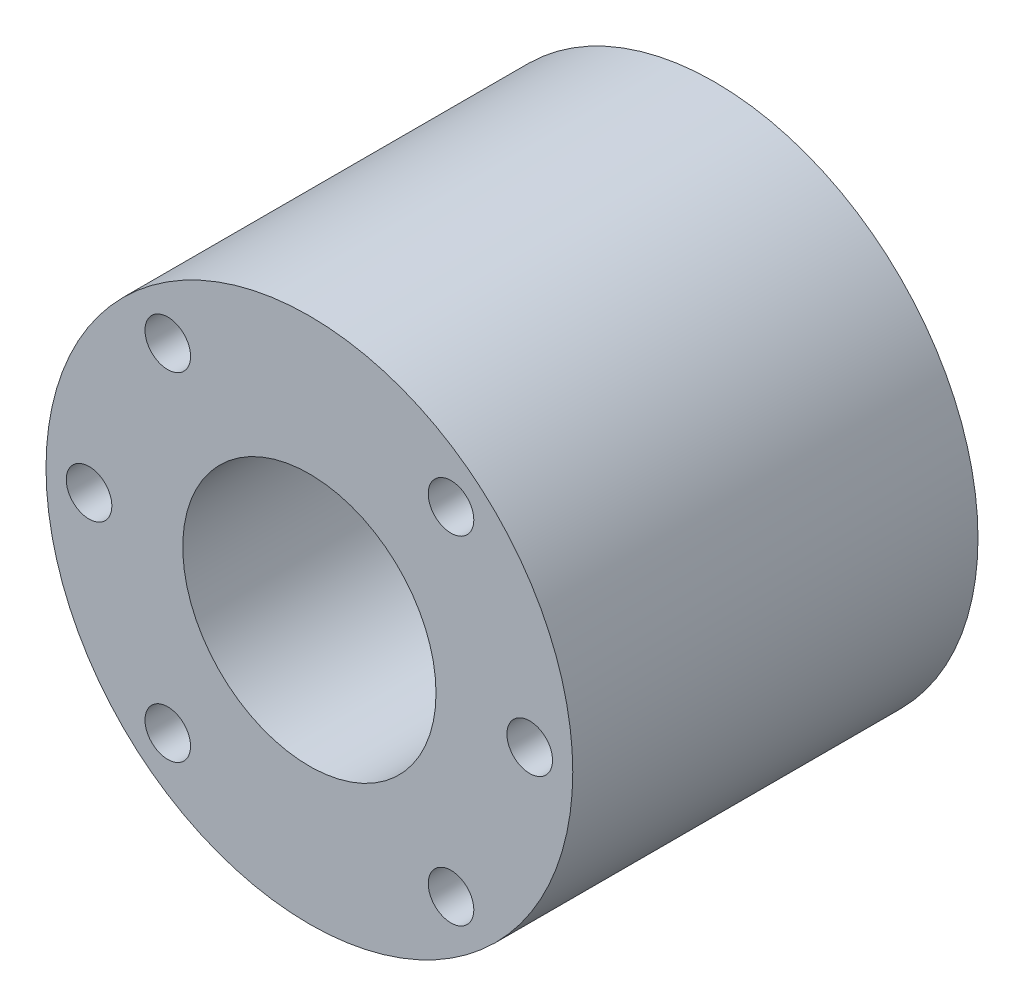
ISO-10303-21;
HEADER;
FILE_DESCRIPTION(('STEP AP214'),'2;1');
FILE_NAME('part.step','',(''),(''),'','','');
FILE_SCHEMA(('AUTOMOTIVE_DESIGN { 1 0 10303 214 1 1 1 1 }'));
ENDSEC;
DATA;
#1=APPLICATION_CONTEXT('core data for automotive mechanical design processes');
#2=APPLICATION_PROTOCOL_DEFINITION('international standard','automotive_design',2000,#1);
#3=PRODUCT_CONTEXT('',#1,'mechanical');
#4=PRODUCT('Part','Part','',(#3));
#5=PRODUCT_RELATED_PRODUCT_CATEGORY('part','',(#4));
#6=PRODUCT_DEFINITION_FORMATION('','',#4);
#7=PRODUCT_DEFINITION_CONTEXT('part definition',#1,'design');
#8=PRODUCT_DEFINITION('design','',#6,#7);
#9=PRODUCT_DEFINITION_SHAPE('','',#8);
#10=(LENGTH_UNIT() NAMED_UNIT(*) SI_UNIT(.MILLI.,.METRE.));
#11=(NAMED_UNIT(*) PLANE_ANGLE_UNIT() SI_UNIT($,.RADIAN.));
#12=(NAMED_UNIT(*) SI_UNIT($,.STERADIAN.) SOLID_ANGLE_UNIT());
#13=UNCERTAINTY_MEASURE_WITH_UNIT(LENGTH_MEASURE(1.E-05),#10,'distance_accuracy_value','');
#14=(GEOMETRIC_REPRESENTATION_CONTEXT(3) GLOBAL_UNCERTAINTY_ASSIGNED_CONTEXT((#13)) GLOBAL_UNIT_ASSIGNED_CONTEXT((#10,
#11,#12)) REPRESENTATION_CONTEXT('',''));
#15=CARTESIAN_POINT('',(0.,0.,0.));
#16=DIRECTION('',(0.,0.,1.));
#17=DIRECTION('',(1.,0.,0.));
#18=AXIS2_PLACEMENT_3D('',#15,#16,#17);
#19=CARTESIAN_POINT('',(0.,0.,40.));
#20=DIRECTION('',(0.,0.,1.));
#21=DIRECTION('',(1.,0.,0.));
#22=AXIS2_PLACEMENT_3D('',#19,#20,#21);
#23=PLANE('',#22);
#24=CARTESIAN_POINT('',(0.,0.,40.));
#25=DIRECTION('',(0.,0.,1.));
#26=DIRECTION('',(1.,0.,0.));
#27=AXIS2_PLACEMENT_3D('',#24,#25,#26);
#28=CIRCLE('',#27,12.5);
#29=CARTESIAN_POINT('',(12.5,0.,40.));
#30=VERTEX_POINT('',#29);
#31=EDGE_CURVE('E105',#30,#30,#28,.T.);
#32=ORIENTED_EDGE('',*,*,#31,.F.);
#33=EDGE_LOOP('',(#32));
#34=FACE_BOUND('',#33,.T.);
#35=CARTESIAN_POINT('',(21.75,0.,40.));
#36=DIRECTION('',(0.,0.,1.));
#37=DIRECTION('',(1.,0.,0.));
#38=AXIS2_PLACEMENT_3D('',#35,#36,#37);
#39=CIRCLE('',#38,2.25);
#40=CARTESIAN_POINT('',(24.,0.,40.));
#41=VERTEX_POINT('',#40);
#42=EDGE_CURVE('E85',#41,#41,#39,.T.);
#43=ORIENTED_EDGE('',*,*,#42,.F.);
#44=EDGE_LOOP('',(#43));
#45=FACE_BOUND('',#44,.T.);
#46=CARTESIAN_POINT('',(-13.9806305106822,-16.6614666378378,40.));
#47=DIRECTION('',(0.,0.,1.));
#48=DIRECTION('',(1.,0.,0.));
#49=AXIS2_PLACEMENT_3D('',#46,#47,#48);
#50=CIRCLE('',#49,2.25);
#51=CARTESIAN_POINT('',(-11.7306305106822,-16.6614666378378,40.));
#52=VERTEX_POINT('',#51);
#53=EDGE_CURVE('E69',#52,#52,#50,.T.);
#54=ORIENTED_EDGE('',*,*,#53,.F.);
#55=EDGE_LOOP('',(#54));
#56=FACE_BOUND('',#55,.T.);
#57=CARTESIAN_POINT('',(-21.75,0.,40.));
#58=DIRECTION('',(0.,0.,1.));
#59=DIRECTION('',(1.,0.,0.));
#60=AXIS2_PLACEMENT_3D('',#57,#58,#59);
#61=CIRCLE('',#60,2.25);
#62=CARTESIAN_POINT('',(-19.5,0.,40.));
#63=VERTEX_POINT('',#62);
#64=EDGE_CURVE('E55',#63,#63,#61,.T.);
#65=ORIENTED_EDGE('',*,*,#64,.F.);
#66=EDGE_LOOP('',(#65));
#67=FACE_BOUND('',#66,.T.);
#68=CARTESIAN_POINT('',(0.,0.,40.));
#69=DIRECTION('',(0.,0.,1.));
#70=DIRECTION('',(1.,0.,0.));
#71=AXIS2_PLACEMENT_3D('',#68,#69,#70);
#72=CIRCLE('',#71,26.);
#73=CARTESIAN_POINT('',(26.,0.,40.));
#74=VERTEX_POINT('',#73);
#75=EDGE_CURVE('E10',#74,#74,#72,.T.);
#76=ORIENTED_EDGE('',*,*,#75,.T.);
#77=EDGE_LOOP('',(#76));
#78=FACE_BOUND('',#77,.T.);
#79=CARTESIAN_POINT('',(-13.9806305106822,16.6614666378378,40.));
#80=DIRECTION('',(0.,0.,1.));
#81=DIRECTION('',(1.,0.,0.));
#82=AXIS2_PLACEMENT_3D('',#79,#80,#81);
#83=CIRCLE('',#82,2.25);
#84=CARTESIAN_POINT('',(-11.7306305106822,16.6614666378378,40.));
#85=VERTEX_POINT('',#84);
#86=EDGE_CURVE('E61',#85,#85,#83,.T.);
#87=ORIENTED_EDGE('',*,*,#86,.F.);
#88=EDGE_LOOP('',(#87));
#89=FACE_BOUND('',#88,.T.);
#90=CARTESIAN_POINT('',(13.9806305106822,-16.6614666378378,40.));
#91=DIRECTION('',(0.,0.,1.));
#92=DIRECTION('',(1.,0.,0.));
#93=AXIS2_PLACEMENT_3D('',#90,#91,#92);
#94=CIRCLE('',#93,2.25);
#95=CARTESIAN_POINT('',(16.2306305106822,-16.6614666378378,40.));
#96=VERTEX_POINT('',#95);
#97=EDGE_CURVE('E77',#96,#96,#94,.T.);
#98=ORIENTED_EDGE('',*,*,#97,.F.);
#99=EDGE_LOOP('',(#98));
#100=FACE_BOUND('',#99,.T.);
#101=CARTESIAN_POINT('',(13.9806305106822,16.6614666378378,40.));
#102=DIRECTION('',(0.,0.,1.));
#103=DIRECTION('',(1.,0.,0.));
#104=AXIS2_PLACEMENT_3D('',#101,#102,#103);
#105=CIRCLE('',#104,2.25);
#106=CARTESIAN_POINT('',(16.2306305106822,16.6614666378378,40.));
#107=VERTEX_POINT('',#106);
#108=EDGE_CURVE('E93',#107,#107,#105,.T.);
#109=ORIENTED_EDGE('',*,*,#108,.F.);
#110=EDGE_LOOP('',(#109));
#111=FACE_BOUND('',#110,.T.);
#112=ADVANCED_FACE('F42',(#34,#45,#56,#67,#78,#89,#100,#111),#23,.T.);
#113=CARTESIAN_POINT('',(0.,0.,0.));
#114=DIRECTION('',(0.,0.,1.));
#115=DIRECTION('',(1.,0.,0.));
#116=AXIS2_PLACEMENT_3D('',#113,#114,#115);
#117=PLANE('',#116);
#118=CARTESIAN_POINT('',(0.,0.,0.));
#119=DIRECTION('',(0.,0.,1.));
#120=DIRECTION('',(1.,0.,0.));
#121=AXIS2_PLACEMENT_3D('',#118,#119,#120);
#122=CIRCLE('',#121,12.5);
#123=CARTESIAN_POINT('',(12.5,0.,0.));
#124=VERTEX_POINT('',#123);
#125=EDGE_CURVE('E101',#124,#124,#122,.T.);
#126=ORIENTED_EDGE('',*,*,#125,.T.);
#127=EDGE_LOOP('',(#126));
#128=FACE_BOUND('',#127,.T.);
#129=CARTESIAN_POINT('',(0.,0.,0.));
#130=DIRECTION('',(0.,0.,1.));
#131=DIRECTION('',(1.,0.,0.));
#132=AXIS2_PLACEMENT_3D('',#129,#130,#131);
#133=CIRCLE('',#132,26.);
#134=CARTESIAN_POINT('',(26.,0.,0.));
#135=VERTEX_POINT('',#134);
#136=EDGE_CURVE('E46',#135,#135,#133,.T.);
#137=ORIENTED_EDGE('',*,*,#136,.F.);
#138=EDGE_LOOP('',(#137));
#139=FACE_BOUND('',#138,.T.);
#140=CARTESIAN_POINT('',(-21.75,0.,0.));
#141=DIRECTION('',(0.,0.,1.));
#142=DIRECTION('',(1.,0.,0.));
#143=AXIS2_PLACEMENT_3D('',#140,#141,#142);
#144=CIRCLE('',#143,2.25);
#145=CARTESIAN_POINT('',(-19.5,0.,0.));
#146=VERTEX_POINT('',#145);
#147=EDGE_CURVE('E57',#146,#146,#144,.T.);
#148=ORIENTED_EDGE('',*,*,#147,.T.);
#149=EDGE_LOOP('',(#148));
#150=FACE_BOUND('',#149,.T.);
#151=CARTESIAN_POINT('',(-13.9806305106822,16.6614666378378,0.));
#152=DIRECTION('',(0.,0.,1.));
#153=DIRECTION('',(1.,0.,0.));
#154=AXIS2_PLACEMENT_3D('',#151,#152,#153);
#155=CIRCLE('',#154,2.25);
#156=CARTESIAN_POINT('',(-11.7306305106822,16.6614666378378,0.));
#157=VERTEX_POINT('',#156);
#158=EDGE_CURVE('E65',#157,#157,#155,.T.);
#159=ORIENTED_EDGE('',*,*,#158,.T.);
#160=EDGE_LOOP('',(#159));
#161=FACE_BOUND('',#160,.T.);
#162=CARTESIAN_POINT('',(-13.9806305106822,-16.6614666378378,0.));
#163=DIRECTION('',(0.,0.,1.));
#164=DIRECTION('',(1.,0.,0.));
#165=AXIS2_PLACEMENT_3D('',#162,#163,#164);
#166=CIRCLE('',#165,2.25);
#167=CARTESIAN_POINT('',(-11.7306305106822,-16.6614666378378,0.));
#168=VERTEX_POINT('',#167);
#169=EDGE_CURVE('E73',#168,#168,#166,.T.);
#170=ORIENTED_EDGE('',*,*,#169,.T.);
#171=EDGE_LOOP('',(#170));
#172=FACE_BOUND('',#171,.T.);
#173=CARTESIAN_POINT('',(13.9806305106822,-16.6614666378378,0.));
#174=DIRECTION('',(0.,0.,1.));
#175=DIRECTION('',(1.,0.,0.));
#176=AXIS2_PLACEMENT_3D('',#173,#174,#175);
#177=CIRCLE('',#176,2.25);
#178=CARTESIAN_POINT('',(16.2306305106822,-16.6614666378378,0.));
#179=VERTEX_POINT('',#178);
#180=EDGE_CURVE('E81',#179,#179,#177,.T.);
#181=ORIENTED_EDGE('',*,*,#180,.T.);
#182=EDGE_LOOP('',(#181));
#183=FACE_BOUND('',#182,.T.);
#184=CARTESIAN_POINT('',(21.75,0.,0.));
#185=DIRECTION('',(0.,0.,1.));
#186=DIRECTION('',(1.,0.,0.));
#187=AXIS2_PLACEMENT_3D('',#184,#185,#186);
#188=CIRCLE('',#187,2.25);
#189=CARTESIAN_POINT('',(24.,0.,0.));
#190=VERTEX_POINT('',#189);
#191=EDGE_CURVE('E89',#190,#190,#188,.T.);
#192=ORIENTED_EDGE('',*,*,#191,.T.);
#193=EDGE_LOOP('',(#192));
#194=FACE_BOUND('',#193,.T.);
#195=CARTESIAN_POINT('',(13.9806305106822,16.6614666378378,0.));
#196=DIRECTION('',(0.,0.,1.));
#197=DIRECTION('',(1.,0.,0.));
#198=AXIS2_PLACEMENT_3D('',#195,#196,#197);
#199=CIRCLE('',#198,2.25);
#200=CARTESIAN_POINT('',(16.2306305106822,16.6614666378378,0.));
#201=VERTEX_POINT('',#200);
#202=EDGE_CURVE('E97',#201,#201,#199,.T.);
#203=ORIENTED_EDGE('',*,*,#202,.T.);
#204=EDGE_LOOP('',(#203));
#205=FACE_BOUND('',#204,.T.);
#206=ADVANCED_FACE('F113',(#128,#139,#150,#161,#172,#183,#194,#205),#117,.F.);
#207=CARTESIAN_POINT('',(0.,0.,40.));
#208=DIRECTION('',(0.,0.,-1.));
#209=DIRECTION('',(-1.,0.,0.));
#210=AXIS2_PLACEMENT_3D('',#207,#208,#209);
#211=CYLINDRICAL_SURFACE('',#210,26.);
#212=ORIENTED_EDGE('',*,*,#75,.F.);
#213=EDGE_LOOP('',(#212));
#214=FACE_BOUND('',#213,.T.);
#215=ORIENTED_EDGE('',*,*,#136,.T.);
#216=EDGE_LOOP('',(#215));
#217=FACE_BOUND('',#216,.T.);
#218=ADVANCED_FACE('F44',(#214,#217),#211,.T.);
#219=CARTESIAN_POINT('',(-21.75,0.,40.));
#220=DIRECTION('',(0.,0.,-1.));
#221=DIRECTION('',(-1.,0.,0.));
#222=AXIS2_PLACEMENT_3D('',#219,#220,#221);
#223=CYLINDRICAL_SURFACE('',#222,2.25);
#224=ORIENTED_EDGE('',*,*,#64,.T.);
#225=EDGE_LOOP('',(#224));
#226=FACE_BOUND('',#225,.T.);
#227=ORIENTED_EDGE('',*,*,#147,.F.);
#228=EDGE_LOOP('',(#227));
#229=FACE_BOUND('',#228,.T.);
#230=ADVANCED_FACE('F148',(#226,#229),#223,.F.);
#231=CARTESIAN_POINT('',(-13.9806305106822,16.6614666378378,40.));
#232=DIRECTION('',(0.,0.,-1.));
#233=DIRECTION('',(-1.,0.,0.));
#234=AXIS2_PLACEMENT_3D('',#231,#232,#233);
#235=CYLINDRICAL_SURFACE('',#234,2.25);
#236=ORIENTED_EDGE('',*,*,#86,.T.);
#237=EDGE_LOOP('',(#236));
#238=FACE_BOUND('',#237,.T.);
#239=ORIENTED_EDGE('',*,*,#158,.F.);
#240=EDGE_LOOP('',(#239));
#241=FACE_BOUND('',#240,.T.);
#242=ADVANCED_FACE('F153',(#238,#241),#235,.F.);
#243=CARTESIAN_POINT('',(-13.9806305106822,-16.6614666378378,40.));
#244=DIRECTION('',(0.,0.,-1.));
#245=DIRECTION('',(-1.,0.,0.));
#246=AXIS2_PLACEMENT_3D('',#243,#244,#245);
#247=CYLINDRICAL_SURFACE('',#246,2.25);
#248=ORIENTED_EDGE('',*,*,#53,.T.);
#249=EDGE_LOOP('',(#248));
#250=FACE_BOUND('',#249,.T.);
#251=ORIENTED_EDGE('',*,*,#169,.F.);
#252=EDGE_LOOP('',(#251));
#253=FACE_BOUND('',#252,.T.);
#254=ADVANCED_FACE('F157',(#250,#253),#247,.F.);
#255=CARTESIAN_POINT('',(13.9806305106822,-16.6614666378378,40.));
#256=DIRECTION('',(0.,0.,-1.));
#257=DIRECTION('',(-1.,0.,0.));
#258=AXIS2_PLACEMENT_3D('',#255,#256,#257);
#259=CYLINDRICAL_SURFACE('',#258,2.25);
#260=ORIENTED_EDGE('',*,*,#97,.T.);
#261=EDGE_LOOP('',(#260));
#262=FACE_BOUND('',#261,.T.);
#263=ORIENTED_EDGE('',*,*,#180,.F.);
#264=EDGE_LOOP('',(#263));
#265=FACE_BOUND('',#264,.T.);
#266=ADVANCED_FACE('F161',(#262,#265),#259,.F.);
#267=CARTESIAN_POINT('',(21.75,0.,40.));
#268=DIRECTION('',(0.,0.,-1.));
#269=DIRECTION('',(-1.,0.,0.));
#270=AXIS2_PLACEMENT_3D('',#267,#268,#269);
#271=CYLINDRICAL_SURFACE('',#270,2.25);
#272=ORIENTED_EDGE('',*,*,#42,.T.);
#273=EDGE_LOOP('',(#272));
#274=FACE_BOUND('',#273,.T.);
#275=ORIENTED_EDGE('',*,*,#191,.F.);
#276=EDGE_LOOP('',(#275));
#277=FACE_BOUND('',#276,.T.);
#278=ADVANCED_FACE('F140',(#274,#277),#271,.F.);
#279=CARTESIAN_POINT('',(13.9806305106822,16.6614666378378,40.));
#280=DIRECTION('',(0.,0.,-1.));
#281=DIRECTION('',(-1.,0.,0.));
#282=AXIS2_PLACEMENT_3D('',#279,#280,#281);
#283=CYLINDRICAL_SURFACE('',#282,2.25);
#284=ORIENTED_EDGE('',*,*,#108,.T.);
#285=EDGE_LOOP('',(#284));
#286=FACE_BOUND('',#285,.T.);
#287=ORIENTED_EDGE('',*,*,#202,.F.);
#288=EDGE_LOOP('',(#287));
#289=FACE_BOUND('',#288,.T.);
#290=ADVANCED_FACE('F119',(#286,#289),#283,.F.);
#291=CARTESIAN_POINT('',(0.,0.,0.));
#292=DIRECTION('',(0.,0.,1.));
#293=DIRECTION('',(1.,0.,0.));
#294=AXIS2_PLACEMENT_3D('',#291,#292,#293);
#295=CYLINDRICAL_SURFACE('',#294,12.5);
#296=ORIENTED_EDGE('',*,*,#125,.F.);
#297=EDGE_LOOP('',(#296));
#298=FACE_BOUND('',#297,.T.);
#299=ORIENTED_EDGE('',*,*,#31,.T.);
#300=EDGE_LOOP('',(#299));
#301=FACE_BOUND('',#300,.T.);
#302=ADVANCED_FACE('F116',(#298,#301),#295,.F.);
#303=CLOSED_SHELL('',(#112,#206,#218,#230,#242,#254,#266,#278,#290,#302));
#304=MANIFOLD_SOLID_BREP('B2',#303);
#305=ADVANCED_BREP_SHAPE_REPRESENTATION('',(#18,#304),#14);
#306=SHAPE_DEFINITION_REPRESENTATION(#9,#305);
ENDSEC;
END-ISO-10303-21;
